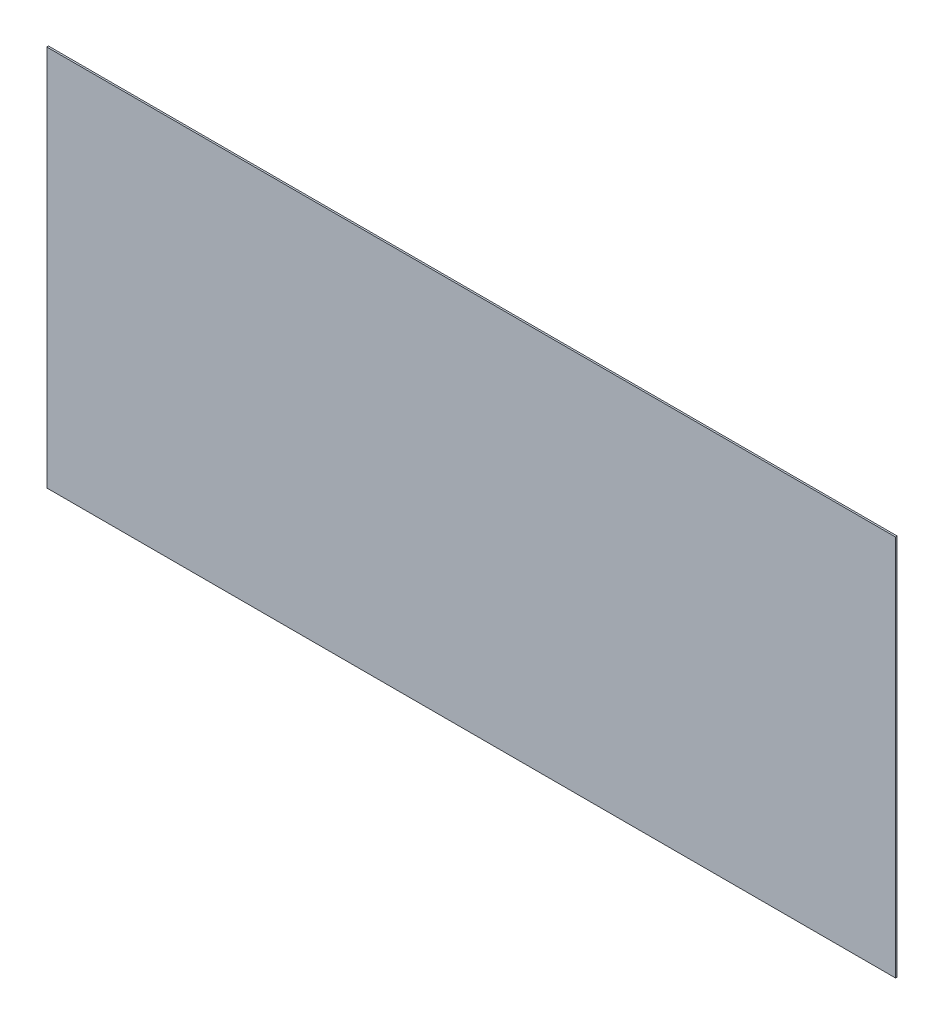
ISO-10303-21;
HEADER;
FILE_DESCRIPTION(('STEP AP214'),'2;1');
FILE_NAME('part.step','',(''),(''),'','','');
FILE_SCHEMA(('AUTOMOTIVE_DESIGN { 1 0 10303 214 1 1 1 1 }'));
ENDSEC;
DATA;
#1=APPLICATION_CONTEXT('core data for automotive mechanical design processes');
#2=APPLICATION_PROTOCOL_DEFINITION('international standard','automotive_design',2000,#1);
#3=PRODUCT_CONTEXT('',#1,'mechanical');
#4=PRODUCT('Part','Part','',(#3));
#5=PRODUCT_RELATED_PRODUCT_CATEGORY('part','',(#4));
#6=PRODUCT_DEFINITION_FORMATION('','',#4);
#7=PRODUCT_DEFINITION_CONTEXT('part definition',#1,'design');
#8=PRODUCT_DEFINITION('design','',#6,#7);
#9=PRODUCT_DEFINITION_SHAPE('','',#8);
#10=(LENGTH_UNIT() NAMED_UNIT(*) SI_UNIT(.MILLI.,.METRE.));
#11=(NAMED_UNIT(*) PLANE_ANGLE_UNIT() SI_UNIT($,.RADIAN.));
#12=(NAMED_UNIT(*) SI_UNIT($,.STERADIAN.) SOLID_ANGLE_UNIT());
#13=UNCERTAINTY_MEASURE_WITH_UNIT(LENGTH_MEASURE(1.E-05),#10,'distance_accuracy_value','');
#14=(GEOMETRIC_REPRESENTATION_CONTEXT(3) GLOBAL_UNCERTAINTY_ASSIGNED_CONTEXT((#13)) GLOBAL_UNIT_ASSIGNED_CONTEXT((#10,
#11,#12)) REPRESENTATION_CONTEXT('',''));
#15=CARTESIAN_POINT('',(0.,0.,0.));
#16=DIRECTION('',(0.,0.,1.));
#17=DIRECTION('',(1.,0.,0.));
#18=AXIS2_PLACEMENT_3D('',#15,#16,#17);
#19=CARTESIAN_POINT('',(500.,225.,2.));
#20=DIRECTION('',(-1.,0.,0.));
#21=DIRECTION('',(0.,0.,1.));
#22=AXIS2_PLACEMENT_3D('',#19,#20,#21);
#23=PLANE('',#22);
#24=DIRECTION('',(0.,1.,0.));
#25=VECTOR('',#24,1.);
#26=CARTESIAN_POINT('',(500.,225.,0.));
#27=LINE('',#26,#25);
#28=CARTESIAN_POINT('',(500.,-225.,0.));
#29=VERTEX_POINT('',#28);
#30=CARTESIAN_POINT('',(500.,225.,0.));
#31=VERTEX_POINT('',#30);
#32=EDGE_CURVE('E102',#29,#31,#27,.T.);
#33=ORIENTED_EDGE('',*,*,#32,.T.);
#34=DIRECTION('',(0.,0.,-1.));
#35=VECTOR('',#34,1.);
#36=CARTESIAN_POINT('',(500.,225.,2.));
#37=LINE('',#36,#35);
#38=CARTESIAN_POINT('',(500.,225.,2.));
#39=VERTEX_POINT('',#38);
#40=EDGE_CURVE('E11',#39,#31,#37,.T.);
#41=ORIENTED_EDGE('',*,*,#40,.F.);
#42=DIRECTION('',(0.,1.,0.));
#43=VECTOR('',#42,1.);
#44=CARTESIAN_POINT('',(500.,225.,2.));
#45=LINE('',#44,#43);
#46=CARTESIAN_POINT('',(500.,-225.,2.));
#47=VERTEX_POINT('',#46);
#48=EDGE_CURVE('E90',#47,#39,#45,.T.);
#49=ORIENTED_EDGE('',*,*,#48,.F.);
#50=DIRECTION('',(0.,0.,-1.));
#51=VECTOR('',#50,1.);
#52=CARTESIAN_POINT('',(500.,-225.,2.));
#53=LINE('',#52,#51);
#54=EDGE_CURVE('E98',#47,#29,#53,.T.);
#55=ORIENTED_EDGE('',*,*,#54,.T.);
#56=EDGE_LOOP('',(#33,#41,#49,#55));
#57=FACE_BOUND('',#56,.T.);
#58=ADVANCED_FACE('F39',(#57),#23,.F.);
#59=CARTESIAN_POINT('',(-500.,225.,2.));
#60=DIRECTION('',(0.,-1.,0.));
#61=DIRECTION('',(0.,0.,-1.));
#62=AXIS2_PLACEMENT_3D('',#59,#60,#61);
#63=PLANE('',#62);
#64=DIRECTION('',(-1.,0.,0.));
#65=VECTOR('',#64,1.);
#66=CARTESIAN_POINT('',(-500.,225.,0.));
#67=LINE('',#66,#65);
#68=CARTESIAN_POINT('',(-500.,225.,0.));
#69=VERTEX_POINT('',#68);
#70=EDGE_CURVE('E94',#31,#69,#67,.T.);
#71=ORIENTED_EDGE('',*,*,#70,.T.);
#72=DIRECTION('',(0.,0.,-1.));
#73=VECTOR('',#72,1.);
#74=CARTESIAN_POINT('',(-500.,225.,2.));
#75=LINE('',#74,#73);
#76=CARTESIAN_POINT('',(-500.,225.,2.));
#77=VERTEX_POINT('',#76);
#78=EDGE_CURVE('E47',#77,#69,#75,.T.);
#79=ORIENTED_EDGE('',*,*,#78,.F.);
#80=DIRECTION('',(-1.,0.,0.));
#81=VECTOR('',#80,1.);
#82=CARTESIAN_POINT('',(-500.,225.,2.));
#83=LINE('',#82,#81);
#84=EDGE_CURVE('E85',#39,#77,#83,.T.);
#85=ORIENTED_EDGE('',*,*,#84,.F.);
#86=ORIENTED_EDGE('',*,*,#40,.T.);
#87=EDGE_LOOP('',(#71,#79,#85,#86));
#88=FACE_BOUND('',#87,.T.);
#89=ADVANCED_FACE('F93',(#88),#63,.F.);
#90=CARTESIAN_POINT('',(-500.,225.,2.));
#91=DIRECTION('',(1.,0.,0.));
#92=DIRECTION('',(0.,1.,0.));
#93=AXIS2_PLACEMENT_3D('',#90,#91,#92);
#94=PLANE('',#93);
#95=DIRECTION('',(0.,-1.,0.));
#96=VECTOR('',#95,1.);
#97=CARTESIAN_POINT('',(-500.,225.,0.));
#98=LINE('',#97,#96);
#99=CARTESIAN_POINT('',(-500.,-225.,0.));
#100=VERTEX_POINT('',#99);
#101=EDGE_CURVE('E72',#69,#100,#98,.T.);
#102=ORIENTED_EDGE('',*,*,#101,.T.);
#103=DIRECTION('',(0.,0.,-1.));
#104=VECTOR('',#103,1.);
#105=CARTESIAN_POINT('',(-500.,-225.,2.));
#106=LINE('',#105,#104);
#107=CARTESIAN_POINT('',(-500.,-225.,2.));
#108=VERTEX_POINT('',#107);
#109=EDGE_CURVE('E95',#108,#100,#106,.T.);
#110=ORIENTED_EDGE('',*,*,#109,.F.);
#111=DIRECTION('',(0.,-1.,0.));
#112=VECTOR('',#111,1.);
#113=CARTESIAN_POINT('',(-500.,225.,2.));
#114=LINE('',#113,#112);
#115=EDGE_CURVE('E88',#77,#108,#114,.T.);
#116=ORIENTED_EDGE('',*,*,#115,.F.);
#117=ORIENTED_EDGE('',*,*,#78,.T.);
#118=EDGE_LOOP('',(#102,#110,#116,#117));
#119=FACE_BOUND('',#118,.T.);
#120=ADVANCED_FACE('F96',(#119),#94,.F.);
#121=CARTESIAN_POINT('',(-500.,-225.,2.));
#122=DIRECTION('',(0.,1.,0.));
#123=DIRECTION('',(0.,0.,1.));
#124=AXIS2_PLACEMENT_3D('',#121,#122,#123);
#125=PLANE('',#124);
#126=DIRECTION('',(1.,0.,0.));
#127=VECTOR('',#126,1.);
#128=CARTESIAN_POINT('',(-500.,-225.,0.));
#129=LINE('',#128,#127);
#130=EDGE_CURVE('E78',#100,#29,#129,.T.);
#131=ORIENTED_EDGE('',*,*,#130,.T.);
#132=ORIENTED_EDGE('',*,*,#54,.F.);
#133=DIRECTION('',(1.,0.,0.));
#134=VECTOR('',#133,1.);
#135=CARTESIAN_POINT('',(-500.,-225.,2.));
#136=LINE('',#135,#134);
#137=EDGE_CURVE('E55',#108,#47,#136,.T.);
#138=ORIENTED_EDGE('',*,*,#137,.F.);
#139=ORIENTED_EDGE('',*,*,#109,.T.);
#140=EDGE_LOOP('',(#131,#132,#138,#139));
#141=FACE_BOUND('',#140,.T.);
#142=ADVANCED_FACE('F109',(#141),#125,.F.);
#143=CARTESIAN_POINT('',(0.,0.,2.));
#144=DIRECTION('',(0.,0.,1.));
#145=DIRECTION('',(1.,0.,0.));
#146=AXIS2_PLACEMENT_3D('',#143,#144,#145);
#147=PLANE('',#146);
#148=ORIENTED_EDGE('',*,*,#48,.T.);
#149=ORIENTED_EDGE('',*,*,#84,.T.);
#150=ORIENTED_EDGE('',*,*,#115,.T.);
#151=ORIENTED_EDGE('',*,*,#137,.T.);
#152=EDGE_LOOP('',(#148,#149,#150,#151));
#153=FACE_BOUND('',#152,.T.);
#154=ADVANCED_FACE('F86',(#153),#147,.T.);
#155=CARTESIAN_POINT('',(0.,0.,0.));
#156=DIRECTION('',(0.,0.,1.));
#157=DIRECTION('',(1.,0.,0.));
#158=AXIS2_PLACEMENT_3D('',#155,#156,#157);
#159=PLANE('',#158);
#160=ORIENTED_EDGE('',*,*,#32,.F.);
#161=ORIENTED_EDGE('',*,*,#130,.F.);
#162=ORIENTED_EDGE('',*,*,#101,.F.);
#163=ORIENTED_EDGE('',*,*,#70,.F.);
#164=EDGE_LOOP('',(#160,#161,#162,#163));
#165=FACE_BOUND('',#164,.T.);
#166=ADVANCED_FACE('F112',(#165),#159,.F.);
#167=CLOSED_SHELL('',(#58,#89,#120,#142,#154,#166));
#168=MANIFOLD_SOLID_BREP('B2',#167);
#169=ADVANCED_BREP_SHAPE_REPRESENTATION('',(#18,#168),#14);
#170=SHAPE_DEFINITION_REPRESENTATION(#9,#169);
ENDSEC;
END-ISO-10303-21;
